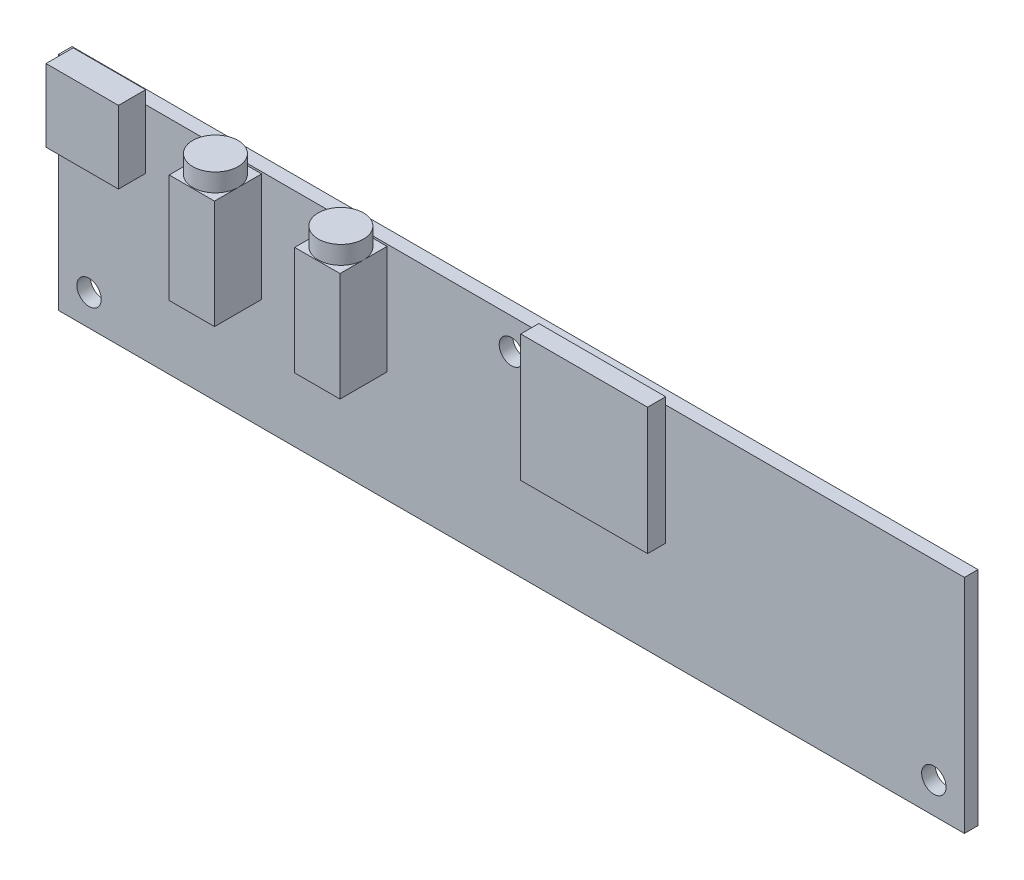
ISO-10303-21;
HEADER;
FILE_DESCRIPTION(('STEP AP214'),'2;1');
FILE_NAME('part.step','',(''),(''),'','','');
FILE_SCHEMA(('AUTOMOTIVE_DESIGN { 1 0 10303 214 1 1 1 1 }'));
ENDSEC;
DATA;
#1=APPLICATION_CONTEXT('core data for automotive mechanical design processes');
#2=APPLICATION_PROTOCOL_DEFINITION('international standard','automotive_design',2000,#1);
#3=PRODUCT_CONTEXT('',#1,'mechanical');
#4=PRODUCT('Part','Part','',(#3));
#5=PRODUCT_RELATED_PRODUCT_CATEGORY('part','',(#4));
#6=PRODUCT_DEFINITION_FORMATION('','',#4);
#7=PRODUCT_DEFINITION_CONTEXT('part definition',#1,'design');
#8=PRODUCT_DEFINITION('design','',#6,#7);
#9=PRODUCT_DEFINITION_SHAPE('','',#8);
#10=(LENGTH_UNIT() NAMED_UNIT(*) SI_UNIT(.MILLI.,.METRE.));
#11=(NAMED_UNIT(*) PLANE_ANGLE_UNIT() SI_UNIT($,.RADIAN.));
#12=(NAMED_UNIT(*) SI_UNIT($,.STERADIAN.) SOLID_ANGLE_UNIT());
#13=UNCERTAINTY_MEASURE_WITH_UNIT(LENGTH_MEASURE(1.E-05),#10,'distance_accuracy_value','');
#14=(GEOMETRIC_REPRESENTATION_CONTEXT(3) GLOBAL_UNCERTAINTY_ASSIGNED_CONTEXT((#13)) GLOBAL_UNIT_ASSIGNED_CONTEXT((#10,
#11,#12)) REPRESENTATION_CONTEXT('',''));
#15=CARTESIAN_POINT('',(0.,0.,0.));
#16=DIRECTION('',(0.,0.,1.));
#17=DIRECTION('',(1.,0.,0.));
#18=AXIS2_PLACEMENT_3D('',#15,#16,#17);
#19=CARTESIAN_POINT('',(0.,0.,1.5));
#20=DIRECTION('',(0.,0.,-1.));
#21=DIRECTION('',(-1.,0.,0.));
#22=AXIS2_PLACEMENT_3D('',#19,#20,#21);
#23=PLANE('',#22);
#24=DIRECTION('',(1.,0.,0.));
#25=VECTOR('',#24,1.);
#26=CARTESIAN_POINT('',(0.,12.025,1.5));
#27=LINE('',#26,#25);
#28=CARTESIAN_POINT('',(-18.725,12.025,1.5));
#29=VERTEX_POINT('',#28);
#30=CARTESIAN_POINT('',(-13.725,12.025,1.5));
#31=VERTEX_POINT('',#30);
#32=EDGE_CURVE('E311',#29,#31,#27,.T.);
#33=ORIENTED_EDGE('',*,*,#32,.T.);
#34=DIRECTION('',(0.,-1.,0.));
#35=VECTOR('',#34,1.);
#36=CARTESIAN_POINT('',(-13.725,0.,1.5));
#37=LINE('',#36,#35);
#38=CARTESIAN_POINT('',(-13.725,0.0249999999999955,1.5));
#39=VERTEX_POINT('',#38);
#40=EDGE_CURVE('E287',#31,#39,#37,.T.);
#41=ORIENTED_EDGE('',*,*,#40,.T.);
#42=DIRECTION('',(1.,0.,0.));
#43=VECTOR('',#42,1.);
#44=CARTESIAN_POINT('',(0.,0.0249999999999955,1.5));
#45=LINE('',#44,#43);
#46=CARTESIAN_POINT('',(-18.725,0.0249999999999955,1.5));
#47=VERTEX_POINT('',#46);
#48=EDGE_CURVE('E301',#47,#39,#45,.T.);
#49=ORIENTED_EDGE('',*,*,#48,.F.);
#50=DIRECTION('',(0.,-1.,0.));
#51=VECTOR('',#50,1.);
#52=CARTESIAN_POINT('',(-18.725,0.,1.5));
#53=LINE('',#52,#51);
#54=EDGE_CURVE('E314',#29,#47,#53,.T.);
#55=ORIENTED_EDGE('',*,*,#54,.F.);
#56=EDGE_LOOP('',(#33,#41,#49,#55));
#57=FACE_BOUND('',#56,.T.);
#58=DIRECTION('',(1.,0.,0.));
#59=VECTOR('',#58,1.);
#60=CARTESIAN_POINT('',(0.,12.025,1.5));
#61=LINE('',#60,#59);
#62=CARTESIAN_POINT('',(-32.575,12.025,1.5));
#63=VERTEX_POINT('',#62);
#64=CARTESIAN_POINT('',(-27.575,12.025,1.5));
#65=VERTEX_POINT('',#64);
#66=EDGE_CURVE('E345',#63,#65,#61,.T.);
#67=ORIENTED_EDGE('',*,*,#66,.T.);
#68=DIRECTION('',(0.,-1.,0.));
#69=VECTOR('',#68,1.);
#70=CARTESIAN_POINT('',(-27.575,0.,1.5));
#71=LINE('',#70,#69);
#72=CARTESIAN_POINT('',(-27.575,0.0250000000000111,1.5));
#73=VERTEX_POINT('',#72);
#74=EDGE_CURVE('E330',#65,#73,#71,.T.);
#75=ORIENTED_EDGE('',*,*,#74,.T.);
#76=DIRECTION('',(1.,0.,0.));
#77=VECTOR('',#76,1.);
#78=CARTESIAN_POINT('',(0.,0.0250000000000111,1.5));
#79=LINE('',#78,#77);
#80=CARTESIAN_POINT('',(-32.575,0.0250000000000111,1.5));
#81=VERTEX_POINT('',#80);
#82=EDGE_CURVE('E335',#81,#73,#79,.T.);
#83=ORIENTED_EDGE('',*,*,#82,.F.);
#84=DIRECTION('',(0.,-1.,0.));
#85=VECTOR('',#84,1.);
#86=CARTESIAN_POINT('',(-32.575,0.,1.5));
#87=LINE('',#86,#85);
#88=EDGE_CURVE('E348',#63,#81,#87,.T.);
#89=ORIENTED_EDGE('',*,*,#88,.F.);
#90=EDGE_LOOP('',(#67,#75,#83,#89));
#91=FACE_BOUND('',#90,.T.);
#92=CARTESIAN_POINT('',(-46.625,-8.825,1.5));
#93=DIRECTION('',(0.,0.,1.));
#94=DIRECTION('',(1.,0.,0.));
#95=AXIS2_PLACEMENT_3D('',#92,#93,#94);
#96=CIRCLE('',#95,1.35);
#97=CARTESIAN_POINT('',(-45.275,-8.825,1.5));
#98=VERTEX_POINT('',#97);
#99=EDGE_CURVE('E377',#98,#98,#96,.T.);
#100=ORIENTED_EDGE('',*,*,#99,.F.);
#101=EDGE_LOOP('',(#100));
#102=FACE_BOUND('',#101,.T.);
#103=CARTESIAN_POINT('',(46.625,-8.825,1.5));
#104=DIRECTION('',(0.,0.,1.));
#105=DIRECTION('',(1.,0.,0.));
#106=AXIS2_PLACEMENT_3D('',#103,#104,#105);
#107=CIRCLE('',#106,1.35);
#108=CARTESIAN_POINT('',(47.975,-8.825,1.5));
#109=VERTEX_POINT('',#108);
#110=EDGE_CURVE('E371',#109,#109,#107,.T.);
#111=ORIENTED_EDGE('',*,*,#110,.F.);
#112=EDGE_LOOP('',(#111));
#113=FACE_BOUND('',#112,.T.);
#114=CARTESIAN_POINT('',(0.,8.825,1.5));
#115=DIRECTION('',(0.,0.,1.));
#116=DIRECTION('',(1.,0.,0.));
#117=AXIS2_PLACEMENT_3D('',#114,#115,#116);
#118=CIRCLE('',#117,1.35);
#119=CARTESIAN_POINT('',(1.35,8.825,1.5));
#120=VERTEX_POINT('',#119);
#121=EDGE_CURVE('E365',#120,#120,#118,.T.);
#122=ORIENTED_EDGE('',*,*,#121,.F.);
#123=EDGE_LOOP('',(#122));
#124=FACE_BOUND('',#123,.T.);
#125=DIRECTION('',(0.,1.,0.));
#126=VECTOR('',#125,1.);
#127=CARTESIAN_POINT('',(17.025,13.025,1.5));
#128=LINE('',#127,#126);
#129=CARTESIAN_POINT('',(17.025,-0.975,1.5));
#130=VERTEX_POINT('',#129);
#131=CARTESIAN_POINT('',(17.025,12.24,1.5));
#132=VERTEX_POINT('',#131);
#133=EDGE_CURVE('E77',#130,#132,#128,.T.);
#134=ORIENTED_EDGE('',*,*,#133,.F.);
#135=DIRECTION('',(1.,0.,0.));
#136=VECTOR('',#135,1.);
#137=CARTESIAN_POINT('',(3.02500000000001,-0.975,1.5));
#138=LINE('',#137,#136);
#139=CARTESIAN_POINT('',(3.02500000000001,-0.975,1.5));
#140=VERTEX_POINT('',#139);
#141=EDGE_CURVE('E81',#140,#130,#138,.T.);
#142=ORIENTED_EDGE('',*,*,#141,.F.);
#143=DIRECTION('',(0.,-1.,0.));
#144=VECTOR('',#143,1.);
#145=CARTESIAN_POINT('',(3.025,13.025,1.5));
#146=LINE('',#145,#144);
#147=CARTESIAN_POINT('',(3.025,12.24,1.5));
#148=VERTEX_POINT('',#147);
#149=EDGE_CURVE('E440',#148,#140,#146,.T.);
#150=ORIENTED_EDGE('',*,*,#149,.F.);
#151=DIRECTION('',(-1.,0.,0.));
#152=VECTOR('',#151,1.);
#153=CARTESIAN_POINT('',(-50.,12.24,1.5));
#154=LINE('',#153,#152);
#155=CARTESIAN_POINT('',(-40.375,12.24,1.5));
#156=VERTEX_POINT('',#155);
#157=EDGE_CURVE('E392',#148,#156,#154,.T.);
#158=ORIENTED_EDGE('',*,*,#157,.T.);
#159=DIRECTION('',(0.,-1.,0.));
#160=VECTOR('',#159,1.);
#161=CARTESIAN_POINT('',(-40.375,0.,1.5));
#162=LINE('',#161,#160);
#163=CARTESIAN_POINT('',(-40.375,5.675,1.5));
#164=VERTEX_POINT('',#163);
#165=EDGE_CURVE('E278',#156,#164,#162,.T.);
#166=ORIENTED_EDGE('',*,*,#165,.T.);
#167=DIRECTION('',(1.,0.,0.));
#168=VECTOR('',#167,1.);
#169=CARTESIAN_POINT('',(0.,5.675,1.5));
#170=LINE('',#169,#168);
#171=CARTESIAN_POINT('',(-48.375,5.675,1.5));
#172=VERTEX_POINT('',#171);
#173=EDGE_CURVE('E269',#172,#164,#170,.T.);
#174=ORIENTED_EDGE('',*,*,#173,.F.);
#175=DIRECTION('',(0.,-1.,0.));
#176=VECTOR('',#175,1.);
#177=CARTESIAN_POINT('',(-48.375,0.,1.5));
#178=LINE('',#177,#176);
#179=CARTESIAN_POINT('',(-48.375,12.24,1.5));
#180=VERTEX_POINT('',#179);
#181=EDGE_CURVE('E277',#180,#172,#178,.T.);
#182=ORIENTED_EDGE('',*,*,#181,.F.);
#183=CARTESIAN_POINT('',(-50.,12.24,1.5));
#184=VERTEX_POINT('',#183);
#185=EDGE_CURVE('E386',#180,#184,#154,.T.);
#186=ORIENTED_EDGE('',*,*,#185,.T.);
#187=DIRECTION('',(0.,-1.,0.));
#188=VECTOR('',#187,1.);
#189=CARTESIAN_POINT('',(-50.,-12.24,1.5));
#190=LINE('',#189,#188);
#191=CARTESIAN_POINT('',(-50.,-12.24,1.5));
#192=VERTEX_POINT('',#191);
#193=EDGE_CURVE('E390',#184,#192,#190,.T.);
#194=ORIENTED_EDGE('',*,*,#193,.T.);
#195=DIRECTION('',(1.,0.,0.));
#196=VECTOR('',#195,1.);
#197=CARTESIAN_POINT('',(-50.,-12.24,1.5));
#198=LINE('',#197,#196);
#199=CARTESIAN_POINT('',(50.,-12.24,1.5));
#200=VERTEX_POINT('',#199);
#201=EDGE_CURVE('E395',#192,#200,#198,.T.);
#202=ORIENTED_EDGE('',*,*,#201,.T.);
#203=DIRECTION('',(0.,1.,0.));
#204=VECTOR('',#203,1.);
#205=CARTESIAN_POINT('',(50.,-12.24,1.5));
#206=LINE('',#205,#204);
#207=CARTESIAN_POINT('',(50.,12.24,1.5));
#208=VERTEX_POINT('',#207);
#209=EDGE_CURVE('E383',#200,#208,#206,.T.);
#210=ORIENTED_EDGE('',*,*,#209,.T.);
#211=EDGE_CURVE('E388',#208,#132,#154,.T.);
#212=ORIENTED_EDGE('',*,*,#211,.T.);
#213=EDGE_LOOP('',(#134,#142,#150,#158,#166,#174,#182,#186,#194,#202,#210,#212));
#214=FACE_BOUND('',#213,.T.);
#215=ADVANCED_FACE('F62',(#57,#91,#102,#113,#124,#214),#23,.F.);
#216=CARTESIAN_POINT('',(0.,12.025,6.7));
#217=DIRECTION('',(0.,1.,0.));
#218=DIRECTION('',(0.,0.,1.));
#219=AXIS2_PLACEMENT_3D('',#216,#217,#218);
#220=PLANE('',#219);
#221=DIRECTION('',(0.,0.,-1.));
#222=VECTOR('',#221,1.);
#223=CARTESIAN_POINT('',(-27.575,12.025,6.7));
#224=LINE('',#223,#222);
#225=CARTESIAN_POINT('',(-27.575,12.025,4.1));
#226=VERTEX_POINT('',#225);
#227=EDGE_CURVE('E360',#226,#65,#224,.T.);
#228=ORIENTED_EDGE('',*,*,#227,.T.);
#229=ORIENTED_EDGE('',*,*,#66,.F.);
#230=DIRECTION('',(0.,0.,-1.));
#231=VECTOR('',#230,1.);
#232=CARTESIAN_POINT('',(-32.575,12.025,6.7));
#233=LINE('',#232,#231);
#234=CARTESIAN_POINT('',(-32.575,12.025,4.1));
#235=VERTEX_POINT('',#234);
#236=EDGE_CURVE('E356',#235,#63,#233,.T.);
#237=ORIENTED_EDGE('',*,*,#236,.F.);
#238=CARTESIAN_POINT('',(-30.075,12.025,4.1));
#239=DIRECTION('',(0.,1.,0.));
#240=DIRECTION('',(0.,0.,1.));
#241=AXIS2_PLACEMENT_3D('',#238,#239,#240);
#242=CIRCLE('',#241,2.5);
#243=EDGE_CURVE('E249',#226,#235,#242,.T.);
#244=ORIENTED_EDGE('',*,*,#243,.F.);
#245=EDGE_LOOP('',(#228,#229,#237,#244));
#246=FACE_BOUND('',#245,.T.);
#247=ADVANCED_FACE('F474',(#246),#220,.T.);
#248=CARTESIAN_POINT('',(0.,12.025,6.7));
#249=DIRECTION('',(0.,1.,0.));
#250=DIRECTION('',(0.,0.,1.));
#251=AXIS2_PLACEMENT_3D('',#248,#249,#250);
#252=PLANE('',#251);
#253=DIRECTION('',(0.,0.,-1.));
#254=VECTOR('',#253,1.);
#255=CARTESIAN_POINT('',(-13.725,12.025,6.7));
#256=LINE('',#255,#254);
#257=CARTESIAN_POINT('',(-13.725,12.025,4.1));
#258=VERTEX_POINT('',#257);
#259=EDGE_CURVE('E326',#258,#31,#256,.T.);
#260=ORIENTED_EDGE('',*,*,#259,.T.);
#261=ORIENTED_EDGE('',*,*,#32,.F.);
#262=DIRECTION('',(0.,0.,-1.));
#263=VECTOR('',#262,1.);
#264=CARTESIAN_POINT('',(-18.725,12.025,6.7));
#265=LINE('',#264,#263);
#266=CARTESIAN_POINT('',(-18.725,12.025,4.1));
#267=VERTEX_POINT('',#266);
#268=EDGE_CURVE('E322',#267,#29,#265,.T.);
#269=ORIENTED_EDGE('',*,*,#268,.F.);
#270=CARTESIAN_POINT('',(-16.225,12.025,4.1));
#271=DIRECTION('',(0.,1.,0.));
#272=DIRECTION('',(0.,0.,1.));
#273=AXIS2_PLACEMENT_3D('',#270,#271,#272);
#274=CIRCLE('',#273,2.5);
#275=EDGE_CURVE('E263',#258,#267,#274,.T.);
#276=ORIENTED_EDGE('',*,*,#275,.F.);
#277=EDGE_LOOP('',(#260,#261,#269,#276));
#278=FACE_BOUND('',#277,.T.);
#279=ADVANCED_FACE('F480',(#278),#252,.T.);
#280=CARTESIAN_POINT('',(0.,0.,0.));
#281=DIRECTION('',(0.,0.,-1.));
#282=DIRECTION('',(-1.,0.,0.));
#283=AXIS2_PLACEMENT_3D('',#280,#281,#282);
#284=PLANE('',#283);
#285=CARTESIAN_POINT('',(46.625,-8.825,0.));
#286=DIRECTION('',(0.,0.,1.));
#287=DIRECTION('',(1.,0.,0.));
#288=AXIS2_PLACEMENT_3D('',#285,#286,#287);
#289=CIRCLE('',#288,1.35);
#290=CARTESIAN_POINT('',(47.975,-8.825,0.));
#291=VERTEX_POINT('',#290);
#292=EDGE_CURVE('E368',#291,#291,#289,.T.);
#293=ORIENTED_EDGE('',*,*,#292,.T.);
#294=EDGE_LOOP('',(#293));
#295=FACE_BOUND('',#294,.T.);
#296=DIRECTION('',(0.,1.,0.));
#297=VECTOR('',#296,1.);
#298=CARTESIAN_POINT('',(50.,-12.24,0.));
#299=LINE('',#298,#297);
#300=CARTESIAN_POINT('',(50.,-12.24,0.));
#301=VERTEX_POINT('',#300);
#302=CARTESIAN_POINT('',(50.,12.24,0.));
#303=VERTEX_POINT('',#302);
#304=EDGE_CURVE('E380',#301,#303,#299,.T.);
#305=ORIENTED_EDGE('',*,*,#304,.F.);
#306=DIRECTION('',(1.,0.,0.));
#307=VECTOR('',#306,1.);
#308=CARTESIAN_POINT('',(-50.,-12.24,0.));
#309=LINE('',#308,#307);
#310=CARTESIAN_POINT('',(-50.,-12.24,0.));
#311=VERTEX_POINT('',#310);
#312=EDGE_CURVE('E387',#311,#301,#309,.T.);
#313=ORIENTED_EDGE('',*,*,#312,.F.);
#314=DIRECTION('',(0.,-1.,0.));
#315=VECTOR('',#314,1.);
#316=CARTESIAN_POINT('',(-50.,-12.24,0.));
#317=LINE('',#316,#315);
#318=CARTESIAN_POINT('',(-50.,12.24,0.));
#319=VERTEX_POINT('',#318);
#320=EDGE_CURVE('E402',#319,#311,#317,.T.);
#321=ORIENTED_EDGE('',*,*,#320,.F.);
#322=DIRECTION('',(-1.,0.,0.));
#323=VECTOR('',#322,1.);
#324=CARTESIAN_POINT('',(-50.,12.24,0.));
#325=LINE('',#324,#323);
#326=EDGE_CURVE('E400',#303,#319,#325,.T.);
#327=ORIENTED_EDGE('',*,*,#326,.F.);
#328=EDGE_LOOP('',(#305,#313,#321,#327));
#329=FACE_BOUND('',#328,.T.);
#330=CARTESIAN_POINT('',(-46.625,-8.825,0.));
#331=DIRECTION('',(0.,0.,1.));
#332=DIRECTION('',(1.,0.,0.));
#333=AXIS2_PLACEMENT_3D('',#330,#331,#332);
#334=CIRCLE('',#333,1.35);
#335=CARTESIAN_POINT('',(-45.275,-8.825,0.));
#336=VERTEX_POINT('',#335);
#337=EDGE_CURVE('E374',#336,#336,#334,.T.);
#338=ORIENTED_EDGE('',*,*,#337,.T.);
#339=EDGE_LOOP('',(#338));
#340=FACE_BOUND('',#339,.T.);
#341=CARTESIAN_POINT('',(0.,8.825,0.));
#342=DIRECTION('',(0.,0.,1.));
#343=DIRECTION('',(1.,0.,0.));
#344=AXIS2_PLACEMENT_3D('',#341,#342,#343);
#345=CIRCLE('',#344,1.35);
#346=CARTESIAN_POINT('',(1.35,8.825,0.));
#347=VERTEX_POINT('',#346);
#348=EDGE_CURVE('E364',#347,#347,#345,.T.);
#349=ORIENTED_EDGE('',*,*,#348,.T.);
#350=EDGE_LOOP('',(#349));
#351=FACE_BOUND('',#350,.T.);
#352=ADVANCED_FACE('F420',(#295,#329,#340,#351),#284,.T.);
#353=CARTESIAN_POINT('',(50.,-12.24,1.5));
#354=DIRECTION('',(-1.,0.,0.));
#355=DIRECTION('',(0.,0.,1.));
#356=AXIS2_PLACEMENT_3D('',#353,#354,#355);
#357=PLANE('',#356);
#358=ORIENTED_EDGE('',*,*,#304,.T.);
#359=DIRECTION('',(0.,0.,-1.));
#360=VECTOR('',#359,1.);
#361=CARTESIAN_POINT('',(50.,12.24,1.5));
#362=LINE('',#361,#360);
#363=EDGE_CURVE('E12',#208,#303,#362,.T.);
#364=ORIENTED_EDGE('',*,*,#363,.F.);
#365=ORIENTED_EDGE('',*,*,#209,.F.);
#366=DIRECTION('',(0.,0.,-1.));
#367=VECTOR('',#366,1.);
#368=CARTESIAN_POINT('',(50.,-12.24,1.5));
#369=LINE('',#368,#367);
#370=EDGE_CURVE('E397',#200,#301,#369,.T.);
#371=ORIENTED_EDGE('',*,*,#370,.T.);
#372=EDGE_LOOP('',(#358,#364,#365,#371));
#373=FACE_BOUND('',#372,.T.);
#374=ADVANCED_FACE('F64',(#373),#357,.F.);
#375=CARTESIAN_POINT('',(-50.,12.24,1.5));
#376=DIRECTION('',(0.,-1.,0.));
#377=DIRECTION('',(0.,0.,-1.));
#378=AXIS2_PLACEMENT_3D('',#375,#376,#377);
#379=PLANE('',#378);
#380=ORIENTED_EDGE('',*,*,#326,.T.);
#381=DIRECTION('',(0.,0.,-1.));
#382=VECTOR('',#381,1.);
#383=CARTESIAN_POINT('',(-50.,12.24,1.5));
#384=LINE('',#383,#382);
#385=EDGE_CURVE('E70',#184,#319,#384,.T.);
#386=ORIENTED_EDGE('',*,*,#385,.F.);
#387=ORIENTED_EDGE('',*,*,#185,.F.);
#388=EDGE_CURVE('E393',#156,#180,#154,.T.);
#389=ORIENTED_EDGE('',*,*,#388,.F.);
#390=ORIENTED_EDGE('',*,*,#157,.F.);
#391=EDGE_CURVE('E391',#132,#148,#154,.T.);
#392=ORIENTED_EDGE('',*,*,#391,.F.);
#393=ORIENTED_EDGE('',*,*,#211,.F.);
#394=ORIENTED_EDGE('',*,*,#363,.T.);
#395=EDGE_LOOP('',(#380,#386,#387,#389,#390,#392,#393,#394));
#396=FACE_BOUND('',#395,.T.);
#397=ADVANCED_FACE('F441',(#396),#379,.F.);
#398=CARTESIAN_POINT('',(-50.,-12.24,1.5));
#399=DIRECTION('',(1.,0.,0.));
#400=DIRECTION('',(0.,0.,-1.));
#401=AXIS2_PLACEMENT_3D('',#398,#399,#400);
#402=PLANE('',#401);
#403=ORIENTED_EDGE('',*,*,#320,.T.);
#404=DIRECTION('',(0.,0.,-1.));
#405=VECTOR('',#404,1.);
#406=CARTESIAN_POINT('',(-50.,-12.24,1.5));
#407=LINE('',#406,#405);
#408=EDGE_CURVE('E407',#192,#311,#407,.T.);
#409=ORIENTED_EDGE('',*,*,#408,.F.);
#410=ORIENTED_EDGE('',*,*,#193,.F.);
#411=ORIENTED_EDGE('',*,*,#385,.T.);
#412=EDGE_LOOP('',(#403,#409,#410,#411));
#413=FACE_BOUND('',#412,.T.);
#414=ADVANCED_FACE('F414',(#413),#402,.F.);
#415=CARTESIAN_POINT('',(-50.,-12.24,1.5));
#416=DIRECTION('',(0.,1.,0.));
#417=DIRECTION('',(0.,0.,1.));
#418=AXIS2_PLACEMENT_3D('',#415,#416,#417);
#419=PLANE('',#418);
#420=ORIENTED_EDGE('',*,*,#312,.T.);
#421=ORIENTED_EDGE('',*,*,#370,.F.);
#422=ORIENTED_EDGE('',*,*,#201,.F.);
#423=ORIENTED_EDGE('',*,*,#408,.T.);
#424=EDGE_LOOP('',(#420,#421,#422,#423));
#425=FACE_BOUND('',#424,.T.);
#426=ADVANCED_FACE('F424',(#425),#419,.F.);
#427=CARTESIAN_POINT('',(-46.625,-8.825,1.5));
#428=DIRECTION('',(0.,0.,-1.));
#429=DIRECTION('',(-1.,0.,0.));
#430=AXIS2_PLACEMENT_3D('',#427,#428,#429);
#431=CYLINDRICAL_SURFACE('',#430,1.35);
#432=ORIENTED_EDGE('',*,*,#99,.T.);
#433=EDGE_LOOP('',(#432));
#434=FACE_BOUND('',#433,.T.);
#435=ORIENTED_EDGE('',*,*,#337,.F.);
#436=EDGE_LOOP('',(#435));
#437=FACE_BOUND('',#436,.T.);
#438=ADVANCED_FACE('F487',(#434,#437),#431,.F.);
#439=CARTESIAN_POINT('',(46.625,-8.825,1.5));
#440=DIRECTION('',(0.,0.,-1.));
#441=DIRECTION('',(-1.,0.,0.));
#442=AXIS2_PLACEMENT_3D('',#439,#440,#441);
#443=CYLINDRICAL_SURFACE('',#442,1.35);
#444=ORIENTED_EDGE('',*,*,#110,.T.);
#445=EDGE_LOOP('',(#444));
#446=FACE_BOUND('',#445,.T.);
#447=ORIENTED_EDGE('',*,*,#292,.F.);
#448=EDGE_LOOP('',(#447));
#449=FACE_BOUND('',#448,.T.);
#450=ADVANCED_FACE('F636',(#446,#449),#443,.F.);
#451=CARTESIAN_POINT('',(0.,8.825,1.5));
#452=DIRECTION('',(0.,0.,-1.));
#453=DIRECTION('',(-1.,0.,0.));
#454=AXIS2_PLACEMENT_3D('',#451,#452,#453);
#455=CYLINDRICAL_SURFACE('',#454,1.35);
#456=ORIENTED_EDGE('',*,*,#121,.T.);
#457=EDGE_LOOP('',(#456));
#458=FACE_BOUND('',#457,.T.);
#459=ORIENTED_EDGE('',*,*,#348,.F.);
#460=EDGE_LOOP('',(#459));
#461=FACE_BOUND('',#460,.T.);
#462=ADVANCED_FACE('F631',(#458,#461),#455,.F.);
#463=CARTESIAN_POINT('',(-27.575,0.,6.7));
#464=DIRECTION('',(1.,0.,0.));
#465=DIRECTION('',(0.,1.,0.));
#466=AXIS2_PLACEMENT_3D('',#463,#464,#465);
#467=PLANE('',#466);
#468=DIRECTION('',(0.,0.,-1.));
#469=VECTOR('',#468,1.);
#470=CARTESIAN_POINT('',(-27.575,0.0250000000000111,6.7));
#471=LINE('',#470,#469);
#472=CARTESIAN_POINT('',(-27.575,0.0250000000000111,6.7));
#473=VERTEX_POINT('',#472);
#474=EDGE_CURVE('E342',#473,#73,#471,.T.);
#475=ORIENTED_EDGE('',*,*,#474,.T.);
#476=ORIENTED_EDGE('',*,*,#74,.F.);
#477=ORIENTED_EDGE('',*,*,#227,.F.);
#478=CARTESIAN_POINT('',(-27.575,12.025,6.7));
#479=VERTEX_POINT('',#478);
#480=EDGE_CURVE('E361',#479,#226,#224,.T.);
#481=ORIENTED_EDGE('',*,*,#480,.F.);
#482=DIRECTION('',(0.,-1.,0.));
#483=VECTOR('',#482,1.);
#484=CARTESIAN_POINT('',(-27.575,0.,6.7));
#485=LINE('',#484,#483);
#486=EDGE_CURVE('E331',#479,#473,#485,.T.);
#487=ORIENTED_EDGE('',*,*,#486,.T.);
#488=EDGE_LOOP('',(#475,#476,#477,#481,#487));
#489=FACE_BOUND('',#488,.T.);
#490=ADVANCED_FACE('F575',(#489),#467,.T.);
#491=ORIENTED_EDGE('',*,*,#480,.T.);
#492=EDGE_CURVE('E247',#235,#226,#242,.T.);
#493=ORIENTED_EDGE('',*,*,#492,.F.);
#494=CARTESIAN_POINT('',(-32.575,12.025,6.7));
#495=VERTEX_POINT('',#494);
#496=EDGE_CURVE('E357',#495,#235,#233,.T.);
#497=ORIENTED_EDGE('',*,*,#496,.F.);
#498=DIRECTION('',(1.,0.,0.));
#499=VECTOR('',#498,1.);
#500=CARTESIAN_POINT('',(0.,12.025,6.7));
#501=LINE('',#500,#499);
#502=EDGE_CURVE('E334',#495,#479,#501,.T.);
#503=ORIENTED_EDGE('',*,*,#502,.T.);
#504=EDGE_LOOP('',(#491,#493,#497,#503));
#505=FACE_BOUND('',#504,.T.);
#506=ADVANCED_FACE('F483',(#505),#220,.T.);
#507=CARTESIAN_POINT('',(-32.575,0.,6.7));
#508=DIRECTION('',(1.,0.,0.));
#509=DIRECTION('',(0.,1.,0.));
#510=AXIS2_PLACEMENT_3D('',#507,#508,#509);
#511=PLANE('',#510);
#512=ORIENTED_EDGE('',*,*,#236,.T.);
#513=ORIENTED_EDGE('',*,*,#88,.T.);
#514=DIRECTION('',(0.,0.,-1.));
#515=VECTOR('',#514,1.);
#516=CARTESIAN_POINT('',(-32.575,0.0250000000000111,6.7));
#517=LINE('',#516,#515);
#518=CARTESIAN_POINT('',(-32.575,0.0250000000000111,6.7));
#519=VERTEX_POINT('',#518);
#520=EDGE_CURVE('E354',#519,#81,#517,.T.);
#521=ORIENTED_EDGE('',*,*,#520,.F.);
#522=DIRECTION('',(0.,-1.,0.));
#523=VECTOR('',#522,1.);
#524=CARTESIAN_POINT('',(-32.575,0.,6.7));
#525=LINE('',#524,#523);
#526=EDGE_CURVE('E338',#495,#519,#525,.T.);
#527=ORIENTED_EDGE('',*,*,#526,.F.);
#528=ORIENTED_EDGE('',*,*,#496,.T.);
#529=EDGE_LOOP('',(#512,#513,#521,#527,#528));
#530=FACE_BOUND('',#529,.T.);
#531=ADVANCED_FACE('F574',(#530),#511,.F.);
#532=CARTESIAN_POINT('',(0.,0.0250000000000111,6.7));
#533=DIRECTION('',(0.,1.,0.));
#534=DIRECTION('',(0.,0.,1.));
#535=AXIS2_PLACEMENT_3D('',#532,#533,#534);
#536=PLANE('',#535);
#537=ORIENTED_EDGE('',*,*,#520,.T.);
#538=ORIENTED_EDGE('',*,*,#82,.T.);
#539=ORIENTED_EDGE('',*,*,#474,.F.);
#540=DIRECTION('',(1.,0.,0.));
#541=VECTOR('',#540,1.);
#542=CARTESIAN_POINT('',(0.,0.0250000000000111,6.7));
#543=LINE('',#542,#541);
#544=EDGE_CURVE('E340',#519,#473,#543,.T.);
#545=ORIENTED_EDGE('',*,*,#544,.F.);
#546=EDGE_LOOP('',(#537,#538,#539,#545));
#547=FACE_BOUND('',#546,.T.);
#548=ADVANCED_FACE('F623',(#547),#536,.F.);
#549=CARTESIAN_POINT('',(0.,0.,6.7));
#550=DIRECTION('',(0.,0.,1.));
#551=DIRECTION('',(1.,0.,0.));
#552=AXIS2_PLACEMENT_3D('',#549,#550,#551);
#553=PLANE('',#552);
#554=ORIENTED_EDGE('',*,*,#486,.F.);
#555=ORIENTED_EDGE('',*,*,#502,.F.);
#556=ORIENTED_EDGE('',*,*,#526,.T.);
#557=ORIENTED_EDGE('',*,*,#544,.T.);
#558=EDGE_LOOP('',(#554,#555,#556,#557));
#559=FACE_BOUND('',#558,.T.);
#560=ADVANCED_FACE('F618',(#559),#553,.T.);
#561=CARTESIAN_POINT('',(-13.725,0.,6.7));
#562=DIRECTION('',(1.,0.,0.));
#563=DIRECTION('',(0.,1.,0.));
#564=AXIS2_PLACEMENT_3D('',#561,#562,#563);
#565=PLANE('',#564);
#566=DIRECTION('',(0.,0.,-1.));
#567=VECTOR('',#566,1.);
#568=CARTESIAN_POINT('',(-13.725,0.0249999999999955,6.7));
#569=LINE('',#568,#567);
#570=CARTESIAN_POINT('',(-13.725,0.0249999999999955,6.7));
#571=VERTEX_POINT('',#570);
#572=EDGE_CURVE('E308',#571,#39,#569,.T.);
#573=ORIENTED_EDGE('',*,*,#572,.T.);
#574=ORIENTED_EDGE('',*,*,#40,.F.);
#575=ORIENTED_EDGE('',*,*,#259,.F.);
#576=CARTESIAN_POINT('',(-13.725,12.025,6.7));
#577=VERTEX_POINT('',#576);
#578=EDGE_CURVE('E327',#577,#258,#256,.T.);
#579=ORIENTED_EDGE('',*,*,#578,.F.);
#580=DIRECTION('',(0.,-1.,0.));
#581=VECTOR('',#580,1.);
#582=CARTESIAN_POINT('',(-13.725,0.,6.7));
#583=LINE('',#582,#581);
#584=EDGE_CURVE('E297',#577,#571,#583,.T.);
#585=ORIENTED_EDGE('',*,*,#584,.T.);
#586=EDGE_LOOP('',(#573,#574,#575,#579,#585));
#587=FACE_BOUND('',#586,.T.);
#588=ADVANCED_FACE('F561',(#587),#565,.T.);
#589=ORIENTED_EDGE('',*,*,#578,.T.);
#590=EDGE_CURVE('E257',#267,#258,#274,.T.);
#591=ORIENTED_EDGE('',*,*,#590,.F.);
#592=CARTESIAN_POINT('',(-18.725,12.025,6.7));
#593=VERTEX_POINT('',#592);
#594=EDGE_CURVE('E323',#593,#267,#265,.T.);
#595=ORIENTED_EDGE('',*,*,#594,.F.);
#596=DIRECTION('',(1.,0.,0.));
#597=VECTOR('',#596,1.);
#598=CARTESIAN_POINT('',(0.,12.025,6.7));
#599=LINE('',#598,#597);
#600=EDGE_CURVE('E300',#593,#577,#599,.T.);
#601=ORIENTED_EDGE('',*,*,#600,.T.);
#602=EDGE_LOOP('',(#589,#591,#595,#601));
#603=FACE_BOUND('',#602,.T.);
#604=ADVANCED_FACE('F513',(#603),#252,.T.);
#605=CARTESIAN_POINT('',(-18.725,0.,6.7));
#606=DIRECTION('',(1.,0.,0.));
#607=DIRECTION('',(0.,0.,-1.));
#608=AXIS2_PLACEMENT_3D('',#605,#606,#607);
#609=PLANE('',#608);
#610=ORIENTED_EDGE('',*,*,#268,.T.);
#611=ORIENTED_EDGE('',*,*,#54,.T.);
#612=DIRECTION('',(0.,0.,-1.));
#613=VECTOR('',#612,1.);
#614=CARTESIAN_POINT('',(-18.725,0.0249999999999955,6.7));
#615=LINE('',#614,#613);
#616=CARTESIAN_POINT('',(-18.725,0.0249999999999955,6.7));
#617=VERTEX_POINT('',#616);
#618=EDGE_CURVE('E320',#617,#47,#615,.T.);
#619=ORIENTED_EDGE('',*,*,#618,.F.);
#620=DIRECTION('',(0.,-1.,0.));
#621=VECTOR('',#620,1.);
#622=CARTESIAN_POINT('',(-18.725,0.,6.7));
#623=LINE('',#622,#621);
#624=EDGE_CURVE('E304',#593,#617,#623,.T.);
#625=ORIENTED_EDGE('',*,*,#624,.F.);
#626=ORIENTED_EDGE('',*,*,#594,.T.);
#627=EDGE_LOOP('',(#610,#611,#619,#625,#626));
#628=FACE_BOUND('',#627,.T.);
#629=ADVANCED_FACE('F560',(#628),#609,.F.);
#630=CARTESIAN_POINT('',(0.,0.0249999999999955,6.7));
#631=DIRECTION('',(0.,1.,0.));
#632=DIRECTION('',(0.,0.,1.));
#633=AXIS2_PLACEMENT_3D('',#630,#631,#632);
#634=PLANE('',#633);
#635=ORIENTED_EDGE('',*,*,#618,.T.);
#636=ORIENTED_EDGE('',*,*,#48,.T.);
#637=ORIENTED_EDGE('',*,*,#572,.F.);
#638=DIRECTION('',(1.,0.,0.));
#639=VECTOR('',#638,1.);
#640=CARTESIAN_POINT('',(0.,0.0249999999999955,6.7));
#641=LINE('',#640,#639);
#642=EDGE_CURVE('E306',#617,#571,#641,.T.);
#643=ORIENTED_EDGE('',*,*,#642,.F.);
#644=EDGE_LOOP('',(#635,#636,#637,#643));
#645=FACE_BOUND('',#644,.T.);
#646=ADVANCED_FACE('F610',(#645),#634,.F.);
#647=CARTESIAN_POINT('',(0.,0.,6.7));
#648=DIRECTION('',(0.,0.,1.));
#649=DIRECTION('',(1.,0.,0.));
#650=AXIS2_PLACEMENT_3D('',#647,#648,#649);
#651=PLANE('',#650);
#652=ORIENTED_EDGE('',*,*,#584,.F.);
#653=ORIENTED_EDGE('',*,*,#600,.F.);
#654=ORIENTED_EDGE('',*,*,#624,.T.);
#655=ORIENTED_EDGE('',*,*,#642,.T.);
#656=EDGE_LOOP('',(#652,#653,#654,#655));
#657=FACE_BOUND('',#656,.T.);
#658=ADVANCED_FACE('F470',(#657),#651,.T.);
#659=CARTESIAN_POINT('',(0.,0.,1.5));
#660=DIRECTION('',(0.,0.,1.));
#661=DIRECTION('',(1.,0.,0.));
#662=AXIS2_PLACEMENT_3D('',#659,#660,#661);
#663=PLANE('',#662);
#664=CARTESIAN_POINT('',(-40.375,13.675,1.5));
#665=VERTEX_POINT('',#664);
#666=EDGE_CURVE('E274',#665,#156,#162,.T.);
#667=ORIENTED_EDGE('',*,*,#666,.T.);
#668=ORIENTED_EDGE('',*,*,#388,.T.);
#669=CARTESIAN_POINT('',(-48.375,13.675,1.5));
#670=VERTEX_POINT('',#669);
#671=EDGE_CURVE('E279',#670,#180,#178,.T.);
#672=ORIENTED_EDGE('',*,*,#671,.F.);
#673=DIRECTION('',(1.,0.,0.));
#674=VECTOR('',#673,1.);
#675=CARTESIAN_POINT('',(-48.375,13.675,1.5));
#676=LINE('',#675,#674);
#677=EDGE_CURVE('E262',#670,#665,#676,.T.);
#678=ORIENTED_EDGE('',*,*,#677,.T.);
#679=EDGE_LOOP('',(#667,#668,#672,#678));
#680=FACE_BOUND('',#679,.T.);
#681=ADVANCED_FACE('F449',(#680),#663,.F.);
#682=CARTESIAN_POINT('',(-48.375,0.,4.5));
#683=DIRECTION('',(1.,0.,0.));
#684=DIRECTION('',(0.,0.,-1.));
#685=AXIS2_PLACEMENT_3D('',#682,#683,#684);
#686=PLANE('',#685);
#687=DIRECTION('',(0.,0.,-1.));
#688=VECTOR('',#687,1.);
#689=CARTESIAN_POINT('',(-48.375,13.675,4.5));
#690=LINE('',#689,#688);
#691=CARTESIAN_POINT('',(-48.375,13.675,4.5));
#692=VERTEX_POINT('',#691);
#693=EDGE_CURVE('E291',#692,#670,#690,.T.);
#694=ORIENTED_EDGE('',*,*,#693,.T.);
#695=ORIENTED_EDGE('',*,*,#671,.T.);
#696=ORIENTED_EDGE('',*,*,#181,.T.);
#697=DIRECTION('',(0.,0.,-1.));
#698=VECTOR('',#697,1.);
#699=CARTESIAN_POINT('',(-48.375,5.675,4.5));
#700=LINE('',#699,#698);
#701=CARTESIAN_POINT('',(-48.375,5.675,4.5));
#702=VERTEX_POINT('',#701);
#703=EDGE_CURVE('E285',#702,#172,#700,.T.);
#704=ORIENTED_EDGE('',*,*,#703,.F.);
#705=DIRECTION('',(0.,-1.,0.));
#706=VECTOR('',#705,1.);
#707=CARTESIAN_POINT('',(-48.375,0.,4.5));
#708=LINE('',#707,#706);
#709=EDGE_CURVE('E268',#692,#702,#708,.T.);
#710=ORIENTED_EDGE('',*,*,#709,.F.);
#711=EDGE_LOOP('',(#694,#695,#696,#704,#710));
#712=FACE_BOUND('',#711,.T.);
#713=ADVANCED_FACE('F462',(#712),#686,.F.);
#714=CARTESIAN_POINT('',(-40.375,0.,4.5));
#715=DIRECTION('',(1.,0.,0.));
#716=DIRECTION('',(0.,0.,-1.));
#717=AXIS2_PLACEMENT_3D('',#714,#715,#716);
#718=PLANE('',#717);
#719=DIRECTION('',(0.,0.,-1.));
#720=VECTOR('',#719,1.);
#721=CARTESIAN_POINT('',(-40.375,5.675,4.5));
#722=LINE('',#721,#720);
#723=CARTESIAN_POINT('',(-40.375,5.675,4.5));
#724=VERTEX_POINT('',#723);
#725=EDGE_CURVE('E273',#724,#164,#722,.T.);
#726=ORIENTED_EDGE('',*,*,#725,.T.);
#727=ORIENTED_EDGE('',*,*,#165,.F.);
#728=ORIENTED_EDGE('',*,*,#666,.F.);
#729=DIRECTION('',(0.,0.,-1.));
#730=VECTOR('',#729,1.);
#731=CARTESIAN_POINT('',(-40.375,13.675,4.5));
#732=LINE('',#731,#730);
#733=CARTESIAN_POINT('',(-40.375,13.675,4.5));
#734=VERTEX_POINT('',#733);
#735=EDGE_CURVE('E295',#734,#665,#732,.T.);
#736=ORIENTED_EDGE('',*,*,#735,.F.);
#737=DIRECTION('',(0.,-1.,0.));
#738=VECTOR('',#737,1.);
#739=CARTESIAN_POINT('',(-40.375,0.,4.5));
#740=LINE('',#739,#738);
#741=EDGE_CURVE('E265',#734,#724,#740,.T.);
#742=ORIENTED_EDGE('',*,*,#741,.T.);
#743=EDGE_LOOP('',(#726,#727,#728,#736,#742));
#744=FACE_BOUND('',#743,.T.);
#745=ADVANCED_FACE('F446',(#744),#718,.T.);
#746=CARTESIAN_POINT('',(0.,5.675,4.5));
#747=DIRECTION('',(0.,1.,0.));
#748=DIRECTION('',(0.,0.,1.));
#749=AXIS2_PLACEMENT_3D('',#746,#747,#748);
#750=PLANE('',#749);
#751=ORIENTED_EDGE('',*,*,#703,.T.);
#752=ORIENTED_EDGE('',*,*,#173,.T.);
#753=ORIENTED_EDGE('',*,*,#725,.F.);
#754=DIRECTION('',(1.,0.,0.));
#755=VECTOR('',#754,1.);
#756=CARTESIAN_POINT('',(0.,5.675,4.5));
#757=LINE('',#756,#755);
#758=EDGE_CURVE('E271',#702,#724,#757,.T.);
#759=ORIENTED_EDGE('',*,*,#758,.F.);
#760=EDGE_LOOP('',(#751,#752,#753,#759));
#761=FACE_BOUND('',#760,.T.);
#762=ADVANCED_FACE('F460',(#761),#750,.F.);
#763=CARTESIAN_POINT('',(0.,0.,4.5));
#764=DIRECTION('',(0.,0.,1.));
#765=DIRECTION('',(1.,0.,0.));
#766=AXIS2_PLACEMENT_3D('',#763,#764,#765);
#767=PLANE('',#766);
#768=ORIENTED_EDGE('',*,*,#741,.F.);
#769=DIRECTION('',(1.,0.,0.));
#770=VECTOR('',#769,1.);
#771=CARTESIAN_POINT('',(-48.375,13.675,4.5));
#772=LINE('',#771,#770);
#773=EDGE_CURVE('E288',#692,#734,#772,.T.);
#774=ORIENTED_EDGE('',*,*,#773,.F.);
#775=ORIENTED_EDGE('',*,*,#709,.T.);
#776=ORIENTED_EDGE('',*,*,#758,.T.);
#777=EDGE_LOOP('',(#768,#774,#775,#776));
#778=FACE_BOUND('',#777,.T.);
#779=ADVANCED_FACE('F456',(#778),#767,.T.);
#780=CARTESIAN_POINT('',(-48.375,13.675,4.5));
#781=DIRECTION('',(0.,1.,0.));
#782=DIRECTION('',(0.,0.,1.));
#783=AXIS2_PLACEMENT_3D('',#780,#781,#782);
#784=PLANE('',#783);
#785=ORIENTED_EDGE('',*,*,#735,.T.);
#786=ORIENTED_EDGE('',*,*,#677,.F.);
#787=ORIENTED_EDGE('',*,*,#693,.F.);
#788=ORIENTED_EDGE('',*,*,#773,.T.);
#789=EDGE_LOOP('',(#785,#786,#787,#788));
#790=FACE_BOUND('',#789,.T.);
#791=ADVANCED_FACE('F453',(#790),#784,.T.);
#792=CARTESIAN_POINT('',(-16.225,14.025,4.1));
#793=DIRECTION('',(0.,-1.,0.));
#794=DIRECTION('',(0.,0.,-1.));
#795=AXIS2_PLACEMENT_3D('',#792,#793,#794);
#796=CYLINDRICAL_SURFACE('',#795,2.5);
#797=CARTESIAN_POINT('',(-16.225,14.025,4.1));
#798=DIRECTION('',(0.,1.,0.));
#799=DIRECTION('',(0.,0.,1.));
#800=AXIS2_PLACEMENT_3D('',#797,#798,#799);
#801=CIRCLE('',#800,2.5);
#802=CARTESIAN_POINT('',(-16.225,14.025,6.6));
#803=VERTEX_POINT('',#802);
#804=EDGE_CURVE('E259',#803,#803,#801,.T.);
#805=ORIENTED_EDGE('',*,*,#804,.F.);
#806=EDGE_LOOP('',(#805));
#807=FACE_BOUND('',#806,.T.);
#808=ORIENTED_EDGE('',*,*,#275,.T.);
#809=ORIENTED_EDGE('',*,*,#590,.T.);
#810=EDGE_LOOP('',(#808,#809));
#811=FACE_BOUND('',#810,.T.);
#812=ADVANCED_FACE('F549',(#807,#811),#796,.T.);
#813=CARTESIAN_POINT('',(-16.225,14.025,4.1));
#814=DIRECTION('',(0.,1.,0.));
#815=DIRECTION('',(0.,0.,1.));
#816=AXIS2_PLACEMENT_3D('',#813,#814,#815);
#817=PLANE('',#816);
#818=ORIENTED_EDGE('',*,*,#804,.T.);
#819=EDGE_LOOP('',(#818));
#820=FACE_BOUND('',#819,.T.);
#821=ADVANCED_FACE('F544',(#820),#817,.T.);
#822=CARTESIAN_POINT('',(-30.075,14.025,4.1));
#823=DIRECTION('',(0.,-1.,0.));
#824=DIRECTION('',(0.,0.,-1.));
#825=AXIS2_PLACEMENT_3D('',#822,#823,#824);
#826=CYLINDRICAL_SURFACE('',#825,2.5);
#827=CARTESIAN_POINT('',(-30.075,14.025,4.1));
#828=DIRECTION('',(0.,1.,0.));
#829=DIRECTION('',(0.,0.,1.));
#830=AXIS2_PLACEMENT_3D('',#827,#828,#829);
#831=CIRCLE('',#830,2.5);
#832=CARTESIAN_POINT('',(-30.075,14.025,6.6));
#833=VERTEX_POINT('',#832);
#834=EDGE_CURVE('E255',#833,#833,#831,.T.);
#835=ORIENTED_EDGE('',*,*,#834,.F.);
#836=EDGE_LOOP('',(#835));
#837=FACE_BOUND('',#836,.T.);
#838=ORIENTED_EDGE('',*,*,#243,.T.);
#839=ORIENTED_EDGE('',*,*,#492,.T.);
#840=EDGE_LOOP('',(#838,#839));
#841=FACE_BOUND('',#840,.T.);
#842=ADVANCED_FACE('F535',(#837,#841),#826,.T.);
#843=CARTESIAN_POINT('',(-30.075,14.025,4.1));
#844=DIRECTION('',(0.,1.,0.));
#845=DIRECTION('',(0.,0.,1.));
#846=AXIS2_PLACEMENT_3D('',#843,#844,#845);
#847=PLANE('',#846);
#848=ORIENTED_EDGE('',*,*,#834,.T.);
#849=EDGE_LOOP('',(#848));
#850=FACE_BOUND('',#849,.T.);
#851=ADVANCED_FACE('F530',(#850),#847,.T.);
#852=CARTESIAN_POINT('',(0.,0.,1.5));
#853=DIRECTION('',(0.,0.,1.));
#854=DIRECTION('',(1.,0.,0.));
#855=AXIS2_PLACEMENT_3D('',#852,#853,#854);
#856=PLANE('',#855);
#857=CARTESIAN_POINT('',(17.025,13.025,1.5));
#858=VERTEX_POINT('',#857);
#859=EDGE_CURVE('E245',#132,#858,#128,.T.);
#860=ORIENTED_EDGE('',*,*,#859,.F.);
#861=ORIENTED_EDGE('',*,*,#391,.T.);
#862=CARTESIAN_POINT('',(3.025,13.025,1.5));
#863=VERTEX_POINT('',#862);
#864=EDGE_CURVE('E826',#863,#148,#146,.T.);
#865=ORIENTED_EDGE('',*,*,#864,.F.);
#866=DIRECTION('',(-1.,0.,0.));
#867=VECTOR('',#866,1.);
#868=CARTESIAN_POINT('',(3.025,13.025,1.5));
#869=LINE('',#868,#867);
#870=EDGE_CURVE('E832',#858,#863,#869,.T.);
#871=ORIENTED_EDGE('',*,*,#870,.F.);
#872=EDGE_LOOP('',(#860,#861,#865,#871));
#873=FACE_BOUND('',#872,.T.);
#874=ADVANCED_FACE('F534',(#873),#856,.F.);
#875=CARTESIAN_POINT('',(17.025,13.025,3.5));
#876=DIRECTION('',(-1.,0.,0.));
#877=DIRECTION('',(0.,0.,1.));
#878=AXIS2_PLACEMENT_3D('',#875,#876,#877);
#879=PLANE('',#878);
#880=ORIENTED_EDGE('',*,*,#133,.T.);
#881=ORIENTED_EDGE('',*,*,#859,.T.);
#882=DIRECTION('',(0.,0.,-1.));
#883=VECTOR('',#882,1.);
#884=CARTESIAN_POINT('',(17.025,13.025,3.5));
#885=LINE('',#884,#883);
#886=CARTESIAN_POINT('',(17.025,13.025,3.5));
#887=VERTEX_POINT('',#886);
#888=EDGE_CURVE('E227',#887,#858,#885,.T.);
#889=ORIENTED_EDGE('',*,*,#888,.F.);
#890=DIRECTION('',(0.,1.,0.));
#891=VECTOR('',#890,1.);
#892=CARTESIAN_POINT('',(17.025,13.025,3.5));
#893=LINE('',#892,#891);
#894=CARTESIAN_POINT('',(17.025,-0.975,3.5));
#895=VERTEX_POINT('',#894);
#896=EDGE_CURVE('E233',#895,#887,#893,.T.);
#897=ORIENTED_EDGE('',*,*,#896,.F.);
#898=DIRECTION('',(0.,0.,-1.));
#899=VECTOR('',#898,1.);
#900=CARTESIAN_POINT('',(17.025,-0.975,3.5));
#901=LINE('',#900,#899);
#902=EDGE_CURVE('E824',#895,#130,#901,.T.);
#903=ORIENTED_EDGE('',*,*,#902,.T.);
#904=EDGE_LOOP('',(#880,#881,#889,#897,#903));
#905=FACE_BOUND('',#904,.T.);
#906=ADVANCED_FACE('F243',(#905),#879,.F.);
#907=CARTESIAN_POINT('',(3.025,13.025,3.5));
#908=DIRECTION('',(0.,-1.,0.));
#909=DIRECTION('',(0.,0.,-1.));
#910=AXIS2_PLACEMENT_3D('',#907,#908,#909);
#911=PLANE('',#910);
#912=ORIENTED_EDGE('',*,*,#870,.T.);
#913=DIRECTION('',(0.,0.,-1.));
#914=VECTOR('',#913,1.);
#915=CARTESIAN_POINT('',(3.025,13.025,3.5));
#916=LINE('',#915,#914);
#917=CARTESIAN_POINT('',(3.025,13.025,3.5));
#918=VERTEX_POINT('',#917);
#919=EDGE_CURVE('E229',#918,#863,#916,.T.);
#920=ORIENTED_EDGE('',*,*,#919,.F.);
#921=DIRECTION('',(-1.,0.,0.));
#922=VECTOR('',#921,1.);
#923=CARTESIAN_POINT('',(3.025,13.025,3.5));
#924=LINE('',#923,#922);
#925=EDGE_CURVE('E223',#887,#918,#924,.T.);
#926=ORIENTED_EDGE('',*,*,#925,.F.);
#927=ORIENTED_EDGE('',*,*,#888,.T.);
#928=EDGE_LOOP('',(#912,#920,#926,#927));
#929=FACE_BOUND('',#928,.T.);
#930=ADVANCED_FACE('F225',(#929),#911,.F.);
#931=CARTESIAN_POINT('',(3.025,13.025,3.5));
#932=DIRECTION('',(1.,0.,0.));
#933=DIRECTION('',(0.,1.,0.));
#934=AXIS2_PLACEMENT_3D('',#931,#932,#933);
#935=PLANE('',#934);
#936=ORIENTED_EDGE('',*,*,#864,.T.);
#937=ORIENTED_EDGE('',*,*,#149,.T.);
#938=DIRECTION('',(0.,0.,-1.));
#939=VECTOR('',#938,1.);
#940=CARTESIAN_POINT('',(3.02500000000001,-0.975,3.5));
#941=LINE('',#940,#939);
#942=CARTESIAN_POINT('',(3.02500000000001,-0.975,3.5));
#943=VERTEX_POINT('',#942);
#944=EDGE_CURVE('E251',#943,#140,#941,.T.);
#945=ORIENTED_EDGE('',*,*,#944,.F.);
#946=DIRECTION('',(0.,-1.,0.));
#947=VECTOR('',#946,1.);
#948=CARTESIAN_POINT('',(3.025,13.025,3.5));
#949=LINE('',#948,#947);
#950=EDGE_CURVE('E232',#918,#943,#949,.T.);
#951=ORIENTED_EDGE('',*,*,#950,.F.);
#952=ORIENTED_EDGE('',*,*,#919,.T.);
#953=EDGE_LOOP('',(#936,#937,#945,#951,#952));
#954=FACE_BOUND('',#953,.T.);
#955=ADVANCED_FACE('F784',(#954),#935,.F.);
#956=CARTESIAN_POINT('',(3.02500000000001,-0.975,3.5));
#957=DIRECTION('',(0.,1.,0.));
#958=DIRECTION('',(0.,0.,1.));
#959=AXIS2_PLACEMENT_3D('',#956,#957,#958);
#960=PLANE('',#959);
#961=ORIENTED_EDGE('',*,*,#141,.T.);
#962=ORIENTED_EDGE('',*,*,#902,.F.);
#963=DIRECTION('',(1.,0.,0.));
#964=VECTOR('',#963,1.);
#965=CARTESIAN_POINT('',(3.02500000000001,-0.975,3.5));
#966=LINE('',#965,#964);
#967=EDGE_CURVE('E238',#943,#895,#966,.T.);
#968=ORIENTED_EDGE('',*,*,#967,.F.);
#969=ORIENTED_EDGE('',*,*,#944,.T.);
#970=EDGE_LOOP('',(#961,#962,#968,#969));
#971=FACE_BOUND('',#970,.T.);
#972=ADVANCED_FACE('F794',(#971),#960,.F.);
#973=CARTESIAN_POINT('',(0.,0.,3.5));
#974=DIRECTION('',(0.,0.,1.));
#975=DIRECTION('',(1.,0.,0.));
#976=AXIS2_PLACEMENT_3D('',#973,#974,#975);
#977=PLANE('',#976);
#978=ORIENTED_EDGE('',*,*,#896,.T.);
#979=ORIENTED_EDGE('',*,*,#925,.T.);
#980=ORIENTED_EDGE('',*,*,#950,.T.);
#981=ORIENTED_EDGE('',*,*,#967,.T.);
#982=EDGE_LOOP('',(#978,#979,#980,#981));
#983=FACE_BOUND('',#982,.T.);
#984=ADVANCED_FACE('F236',(#983),#977,.T.);
#985=CLOSED_SHELL('',(#215,#247,#279,#352,#374,#397,#414,#426,#438,#450,#462,#490,#506,#531,
#548,#560,#588,#604,#629,#646,#658,#681,#713,#745,#762,#779,#791,#812,#821,#842,#851,#874,#906,
#930,#955,#972,#984));
#986=MANIFOLD_SOLID_BREP('B2',#985);
#987=ADVANCED_BREP_SHAPE_REPRESENTATION('',(#18,#986),#14);
#988=SHAPE_DEFINITION_REPRESENTATION(#9,#987);
ENDSEC;
END-ISO-10303-21;
